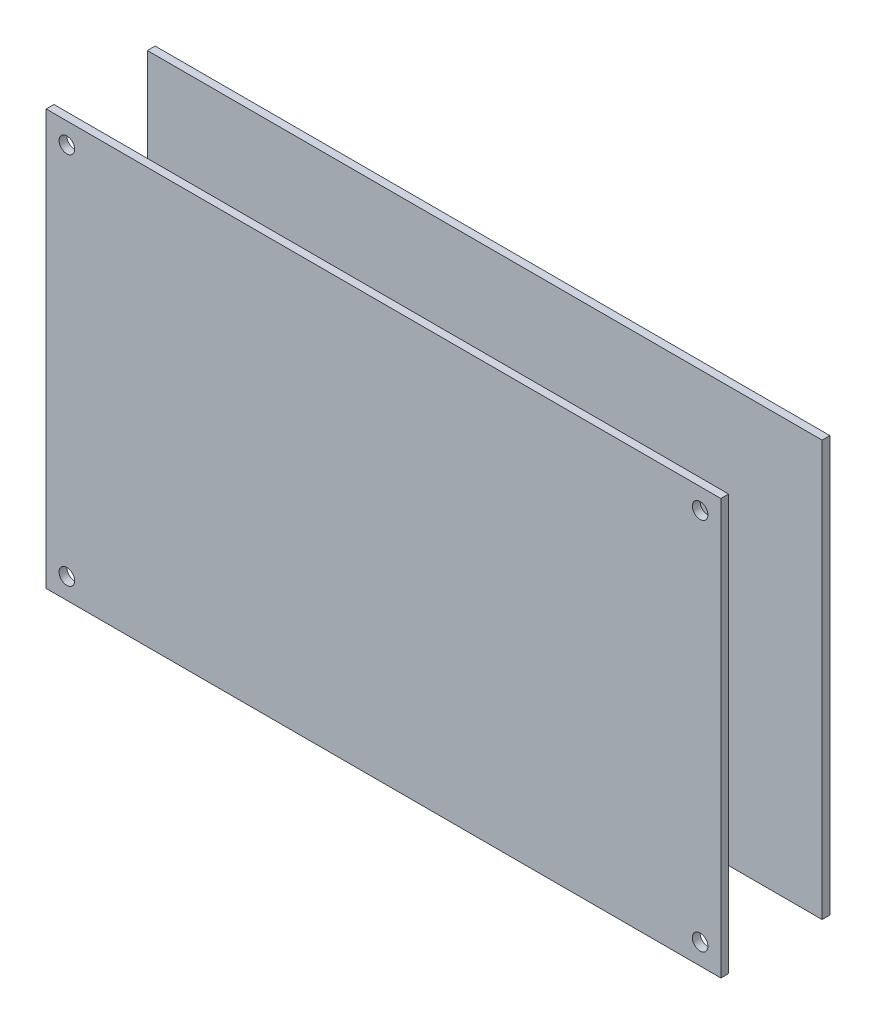
ISO-10303-21;
HEADER;
FILE_DESCRIPTION(('STEP AP214'),'2;1');
FILE_NAME('part.step','',(''),(''),'','','');
FILE_SCHEMA(('AUTOMOTIVE_DESIGN { 1 0 10303 214 1 1 1 1 }'));
ENDSEC;
DATA;
#1=APPLICATION_CONTEXT('core data for automotive mechanical design processes');
#2=APPLICATION_PROTOCOL_DEFINITION('international standard','automotive_design',2000,#1);
#3=PRODUCT_CONTEXT('',#1,'mechanical');
#4=PRODUCT('Part','Part','',(#3));
#5=PRODUCT_RELATED_PRODUCT_CATEGORY('part','',(#4));
#6=PRODUCT_DEFINITION_FORMATION('','',#4);
#7=PRODUCT_DEFINITION_CONTEXT('part definition',#1,'design');
#8=PRODUCT_DEFINITION('design','',#6,#7);
#9=PRODUCT_DEFINITION_SHAPE('','',#8);
#10=(LENGTH_UNIT() NAMED_UNIT(*) SI_UNIT(.MILLI.,.METRE.));
#11=(NAMED_UNIT(*) PLANE_ANGLE_UNIT() SI_UNIT($,.RADIAN.));
#12=(NAMED_UNIT(*) SI_UNIT($,.STERADIAN.) SOLID_ANGLE_UNIT());
#13=UNCERTAINTY_MEASURE_WITH_UNIT(LENGTH_MEASURE(1.E-05),#10,'distance_accuracy_value','');
#14=(GEOMETRIC_REPRESENTATION_CONTEXT(3) GLOBAL_UNCERTAINTY_ASSIGNED_CONTEXT((#13)) GLOBAL_UNIT_ASSIGNED_CONTEXT((#10,
#11,#12)) REPRESENTATION_CONTEXT('',''));
#15=CARTESIAN_POINT('',(0.,0.,0.));
#16=DIRECTION('',(0.,0.,1.));
#17=DIRECTION('',(1.,0.,0.));
#18=AXIS2_PLACEMENT_3D('',#15,#16,#17);
#19=CARTESIAN_POINT('',(0.,0.,21.));
#20=DIRECTION('',(1.,0.,0.));
#21=DIRECTION('',(0.,0.,-1.));
#22=AXIS2_PLACEMENT_3D('',#19,#20,#21);
#23=PLANE('',#22);
#24=DIRECTION('',(0.,-1.,0.));
#25=VECTOR('',#24,1.);
#26=CARTESIAN_POINT('',(0.,0.,1.5));
#27=LINE('',#26,#25);
#28=CARTESIAN_POINT('',(0.,80.,1.5));
#29=VERTEX_POINT('',#28);
#30=CARTESIAN_POINT('',(0.,0.,1.5));
#31=VERTEX_POINT('',#30);
#32=EDGE_CURVE('E71',#29,#31,#27,.T.);
#33=ORIENTED_EDGE('',*,*,#32,.F.);
#34=DIRECTION('',(0.,0.,-1.));
#35=VECTOR('',#34,1.);
#36=CARTESIAN_POINT('',(0.,80.,21.));
#37=LINE('',#36,#35);
#38=CARTESIAN_POINT('',(0.,80.,0.));
#39=VERTEX_POINT('',#38);
#40=EDGE_CURVE('E58',#29,#39,#37,.T.);
#41=ORIENTED_EDGE('',*,*,#40,.T.);
#42=DIRECTION('',(0.,-1.,0.));
#43=VECTOR('',#42,1.);
#44=CARTESIAN_POINT('',(0.,0.,0.));
#45=LINE('',#44,#43);
#46=CARTESIAN_POINT('',(0.,0.,0.));
#47=VERTEX_POINT('',#46);
#48=EDGE_CURVE('E168',#39,#47,#45,.T.);
#49=ORIENTED_EDGE('',*,*,#48,.T.);
#50=DIRECTION('',(0.,0.,-1.));
#51=VECTOR('',#50,1.);
#52=CARTESIAN_POINT('',(0.,0.,21.));
#53=LINE('',#52,#51);
#54=EDGE_CURVE('E166',#31,#47,#53,.T.);
#55=ORIENTED_EDGE('',*,*,#54,.F.);
#56=EDGE_LOOP('',(#33,#41,#49,#55));
#57=FACE_BOUND('',#56,.T.);
#58=ADVANCED_FACE('F55',(#57),#23,.F.);
#59=CARTESIAN_POINT('',(0.,0.,21.));
#60=DIRECTION('',(0.,1.,0.));
#61=DIRECTION('',(0.,0.,1.));
#62=AXIS2_PLACEMENT_3D('',#59,#60,#61);
#63=PLANE('',#62);
#64=DIRECTION('',(1.,0.,0.));
#65=VECTOR('',#64,1.);
#66=CARTESIAN_POINT('',(0.,0.,1.5));
#67=LINE('',#66,#65);
#68=CARTESIAN_POINT('',(130.,0.,1.5));
#69=VERTEX_POINT('',#68);
#70=EDGE_CURVE('E132',#31,#69,#67,.T.);
#71=ORIENTED_EDGE('',*,*,#70,.F.);
#72=ORIENTED_EDGE('',*,*,#54,.T.);
#73=DIRECTION('',(1.,0.,0.));
#74=VECTOR('',#73,1.);
#75=CARTESIAN_POINT('',(0.,0.,0.));
#76=LINE('',#75,#74);
#77=CARTESIAN_POINT('',(130.,0.,0.));
#78=VERTEX_POINT('',#77);
#79=EDGE_CURVE('E165',#47,#78,#76,.T.);
#80=ORIENTED_EDGE('',*,*,#79,.T.);
#81=DIRECTION('',(0.,0.,-1.));
#82=VECTOR('',#81,1.);
#83=CARTESIAN_POINT('',(130.,0.,21.));
#84=LINE('',#83,#82);
#85=EDGE_CURVE('E164',#69,#78,#84,.T.);
#86=ORIENTED_EDGE('',*,*,#85,.F.);
#87=EDGE_LOOP('',(#71,#72,#80,#86));
#88=FACE_BOUND('',#87,.T.);
#89=ADVANCED_FACE('F203',(#88),#63,.F.);
#90=CARTESIAN_POINT('',(130.,0.,21.));
#91=DIRECTION('',(-1.,0.,0.));
#92=DIRECTION('',(0.,0.,1.));
#93=AXIS2_PLACEMENT_3D('',#90,#91,#92);
#94=PLANE('',#93);
#95=DIRECTION('',(0.,0.,-1.));
#96=VECTOR('',#95,1.);
#97=CARTESIAN_POINT('',(130.,80.,21.));
#98=LINE('',#97,#96);
#99=CARTESIAN_POINT('',(130.,80.,1.5));
#100=VERTEX_POINT('',#99);
#101=CARTESIAN_POINT('',(130.,80.,0.));
#102=VERTEX_POINT('',#101);
#103=EDGE_CURVE('E161',#100,#102,#98,.T.);
#104=ORIENTED_EDGE('',*,*,#103,.F.);
#105=DIRECTION('',(0.,-1.,0.));
#106=VECTOR('',#105,1.);
#107=CARTESIAN_POINT('',(130.,88.5,1.5));
#108=LINE('',#107,#106);
#109=EDGE_CURVE('E78',#100,#69,#108,.T.);
#110=ORIENTED_EDGE('',*,*,#109,.T.);
#111=ORIENTED_EDGE('',*,*,#85,.T.);
#112=DIRECTION('',(0.,1.,0.));
#113=VECTOR('',#112,1.);
#114=CARTESIAN_POINT('',(130.,0.,0.));
#115=LINE('',#114,#113);
#116=EDGE_CURVE('E162',#78,#102,#115,.T.);
#117=ORIENTED_EDGE('',*,*,#116,.T.);
#118=EDGE_LOOP('',(#104,#110,#111,#117));
#119=FACE_BOUND('',#118,.T.);
#120=ADVANCED_FACE('F207',(#119),#94,.F.);
#121=CARTESIAN_POINT('',(0.,80.,21.));
#122=DIRECTION('',(0.,-1.,0.));
#123=DIRECTION('',(0.,0.,-1.));
#124=AXIS2_PLACEMENT_3D('',#121,#122,#123);
#125=PLANE('',#124);
#126=ORIENTED_EDGE('',*,*,#40,.F.);
#127=DIRECTION('',(1.,0.,0.));
#128=VECTOR('',#127,1.);
#129=CARTESIAN_POINT('',(0.,80.,1.5));
#130=LINE('',#129,#128);
#131=EDGE_CURVE('E159',#29,#100,#130,.T.);
#132=ORIENTED_EDGE('',*,*,#131,.T.);
#133=ORIENTED_EDGE('',*,*,#103,.T.);
#134=DIRECTION('',(-1.,0.,0.));
#135=VECTOR('',#134,1.);
#136=CARTESIAN_POINT('',(0.,80.,0.));
#137=LINE('',#136,#135);
#138=EDGE_CURVE('E149',#102,#39,#137,.T.);
#139=ORIENTED_EDGE('',*,*,#138,.T.);
#140=EDGE_LOOP('',(#126,#132,#133,#139));
#141=FACE_BOUND('',#140,.T.);
#142=ADVANCED_FACE('F212',(#141),#125,.F.);
#143=CARTESIAN_POINT('',(0.,0.,0.));
#144=DIRECTION('',(0.,0.,-1.));
#145=DIRECTION('',(-1.,0.,0.));
#146=AXIS2_PLACEMENT_3D('',#143,#144,#145);
#147=PLANE('',#146);
#148=DIRECTION('',(-1.,0.,0.));
#149=VECTOR('',#148,1.);
#150=CARTESIAN_POINT('',(116.910280936321,5.93796427226272,0.));
#151=LINE('',#150,#149);
#152=CARTESIAN_POINT('',(116.910280936321,5.93796427226272,0.));
#153=VERTEX_POINT('',#152);
#154=CARTESIAN_POINT('',(11.4102809363213,5.93796427226272,0.));
#155=VERTEX_POINT('',#154);
#156=EDGE_CURVE('E121',#153,#155,#151,.T.);
#157=ORIENTED_EDGE('',*,*,#156,.F.);
#158=DIRECTION('',(0.,-1.,0.));
#159=VECTOR('',#158,1.);
#160=CARTESIAN_POINT('',(116.910280936321,73.7379642722627,0.));
#161=LINE('',#160,#159);
#162=CARTESIAN_POINT('',(116.910280936321,73.7379642722627,0.));
#163=VERTEX_POINT('',#162);
#164=EDGE_CURVE('E185',#163,#153,#161,.T.);
#165=ORIENTED_EDGE('',*,*,#164,.F.);
#166=DIRECTION('',(-1.,0.,0.));
#167=VECTOR('',#166,1.);
#168=CARTESIAN_POINT('',(116.910280936321,73.7379642722627,0.));
#169=LINE('',#168,#167);
#170=CARTESIAN_POINT('',(11.4102809363213,73.7379642722627,0.));
#171=VERTEX_POINT('',#170);
#172=EDGE_CURVE('E146',#163,#171,#169,.T.);
#173=ORIENTED_EDGE('',*,*,#172,.T.);
#174=DIRECTION('',(0.,-1.,0.));
#175=VECTOR('',#174,1.);
#176=CARTESIAN_POINT('',(11.4102809363213,73.7379642722627,0.));
#177=LINE('',#176,#175);
#178=EDGE_CURVE('E137',#171,#155,#177,.T.);
#179=ORIENTED_EDGE('',*,*,#178,.T.);
#180=EDGE_LOOP('',(#157,#165,#173,#179));
#181=FACE_BOUND('',#180,.T.);
#182=ORIENTED_EDGE('',*,*,#48,.F.);
#183=ORIENTED_EDGE('',*,*,#138,.F.);
#184=ORIENTED_EDGE('',*,*,#116,.F.);
#185=ORIENTED_EDGE('',*,*,#79,.F.);
#186=EDGE_LOOP('',(#182,#183,#184,#185));
#187=FACE_BOUND('',#186,.T.);
#188=ADVANCED_FACE('F143',(#181,#187),#147,.T.);
#189=CARTESIAN_POINT('',(0.,0.,1.5));
#190=DIRECTION('',(0.,0.,-1.));
#191=DIRECTION('',(-1.,0.,0.));
#192=AXIS2_PLACEMENT_3D('',#189,#190,#191);
#193=PLANE('',#192);
#194=ORIENTED_EDGE('',*,*,#32,.T.);
#195=ORIENTED_EDGE('',*,*,#70,.T.);
#196=ORIENTED_EDGE('',*,*,#109,.F.);
#197=ORIENTED_EDGE('',*,*,#131,.F.);
#198=EDGE_LOOP('',(#194,#195,#196,#197));
#199=FACE_BOUND('',#198,.T.);
#200=ADVANCED_FACE('F220',(#199),#193,.F.);
#201=CARTESIAN_POINT('',(116.910280936321,5.93796427226272,-5.));
#202=DIRECTION('',(0.,1.,0.));
#203=DIRECTION('',(0.,0.,1.));
#204=AXIS2_PLACEMENT_3D('',#201,#202,#203);
#205=PLANE('',#204);
#206=ORIENTED_EDGE('',*,*,#156,.T.);
#207=DIRECTION('',(0.,0.,1.));
#208=VECTOR('',#207,1.);
#209=CARTESIAN_POINT('',(11.4102809363213,5.93796427226272,-5.));
#210=LINE('',#209,#208);
#211=CARTESIAN_POINT('',(11.4102809363213,5.93796427226272,-5.));
#212=VERTEX_POINT('',#211);
#213=EDGE_CURVE('E125',#212,#155,#210,.T.);
#214=ORIENTED_EDGE('',*,*,#213,.F.);
#215=DIRECTION('',(-1.,0.,0.));
#216=VECTOR('',#215,1.);
#217=CARTESIAN_POINT('',(116.910280936321,5.93796427226272,-5.));
#218=LINE('',#217,#216);
#219=CARTESIAN_POINT('',(116.910280936321,5.93796427226272,-5.));
#220=VERTEX_POINT('',#219);
#221=EDGE_CURVE('E63',#220,#212,#218,.T.);
#222=ORIENTED_EDGE('',*,*,#221,.F.);
#223=DIRECTION('',(0.,0.,1.));
#224=VECTOR('',#223,1.);
#225=CARTESIAN_POINT('',(116.910280936321,5.93796427226272,-5.));
#226=LINE('',#225,#224);
#227=EDGE_CURVE('E128',#220,#153,#226,.T.);
#228=ORIENTED_EDGE('',*,*,#227,.T.);
#229=EDGE_LOOP('',(#206,#214,#222,#228));
#230=FACE_BOUND('',#229,.T.);
#231=ADVANCED_FACE('F123',(#230),#205,.F.);
#232=CARTESIAN_POINT('',(11.4102809363213,73.7379642722627,-5.));
#233=DIRECTION('',(-1.,0.,0.));
#234=DIRECTION('',(0.,-1.,0.));
#235=AXIS2_PLACEMENT_3D('',#232,#233,#234);
#236=PLANE('',#235);
#237=ORIENTED_EDGE('',*,*,#178,.F.);
#238=DIRECTION('',(0.,0.,1.));
#239=VECTOR('',#238,1.);
#240=CARTESIAN_POINT('',(11.4102809363213,73.7379642722627,-5.));
#241=LINE('',#240,#239);
#242=CARTESIAN_POINT('',(11.4102809363213,73.7379642722627,-5.));
#243=VERTEX_POINT('',#242);
#244=EDGE_CURVE('E155',#243,#171,#241,.T.);
#245=ORIENTED_EDGE('',*,*,#244,.F.);
#246=DIRECTION('',(0.,-1.,0.));
#247=VECTOR('',#246,1.);
#248=CARTESIAN_POINT('',(11.4102809363213,73.7379642722627,-5.));
#249=LINE('',#248,#247);
#250=EDGE_CURVE('E140',#243,#212,#249,.T.);
#251=ORIENTED_EDGE('',*,*,#250,.T.);
#252=ORIENTED_EDGE('',*,*,#213,.T.);
#253=EDGE_LOOP('',(#237,#245,#251,#252));
#254=FACE_BOUND('',#253,.T.);
#255=ADVANCED_FACE('F136',(#254),#236,.T.);
#256=CARTESIAN_POINT('',(116.910280936321,73.7379642722627,-5.));
#257=DIRECTION('',(0.,1.,0.));
#258=DIRECTION('',(0.,0.,1.));
#259=AXIS2_PLACEMENT_3D('',#256,#257,#258);
#260=PLANE('',#259);
#261=ORIENTED_EDGE('',*,*,#172,.F.);
#262=DIRECTION('',(0.,0.,1.));
#263=VECTOR('',#262,1.);
#264=CARTESIAN_POINT('',(116.910280936321,73.7379642722627,-5.));
#265=LINE('',#264,#263);
#266=CARTESIAN_POINT('',(116.910280936321,73.7379642722627,-5.));
#267=VERTEX_POINT('',#266);
#268=EDGE_CURVE('E158',#267,#163,#265,.T.);
#269=ORIENTED_EDGE('',*,*,#268,.F.);
#270=DIRECTION('',(-1.,0.,0.));
#271=VECTOR('',#270,1.);
#272=CARTESIAN_POINT('',(116.910280936321,73.7379642722627,-5.));
#273=LINE('',#272,#271);
#274=EDGE_CURVE('E141',#267,#243,#273,.T.);
#275=ORIENTED_EDGE('',*,*,#274,.T.);
#276=ORIENTED_EDGE('',*,*,#244,.T.);
#277=EDGE_LOOP('',(#261,#269,#275,#276));
#278=FACE_BOUND('',#277,.T.);
#279=ADVANCED_FACE('F192',(#278),#260,.T.);
#280=CARTESIAN_POINT('',(116.910280936321,73.7379642722627,-5.));
#281=DIRECTION('',(-1.,0.,0.));
#282=DIRECTION('',(0.,0.,1.));
#283=AXIS2_PLACEMENT_3D('',#280,#281,#282);
#284=PLANE('',#283);
#285=ORIENTED_EDGE('',*,*,#164,.T.);
#286=ORIENTED_EDGE('',*,*,#227,.F.);
#287=DIRECTION('',(0.,-1.,0.));
#288=VECTOR('',#287,1.);
#289=CARTESIAN_POINT('',(116.910280936321,73.7379642722627,-5.));
#290=LINE('',#289,#288);
#291=EDGE_CURVE('E12',#267,#220,#290,.T.);
#292=ORIENTED_EDGE('',*,*,#291,.F.);
#293=ORIENTED_EDGE('',*,*,#268,.T.);
#294=EDGE_LOOP('',(#285,#286,#292,#293));
#295=FACE_BOUND('',#294,.T.);
#296=ADVANCED_FACE('F188',(#295),#284,.F.);
#297=CARTESIAN_POINT('',(0.,0.,-5.));
#298=DIRECTION('',(0.,0.,1.));
#299=DIRECTION('',(1.,0.,0.));
#300=AXIS2_PLACEMENT_3D('',#297,#298,#299);
#301=PLANE('',#300);
#302=ORIENTED_EDGE('',*,*,#221,.T.);
#303=ORIENTED_EDGE('',*,*,#250,.F.);
#304=ORIENTED_EDGE('',*,*,#274,.F.);
#305=ORIENTED_EDGE('',*,*,#291,.T.);
#306=EDGE_LOOP('',(#302,#303,#304,#305));
#307=FACE_BOUND('',#306,.T.);
#308=ADVANCED_FACE('F194',(#307),#301,.F.);
#309=CLOSED_SHELL('',(#58,#89,#120,#142,#188,#200,#231,#255,#279,#296,#308));
#310=MANIFOLD_SOLID_BREP('B2',#309);
#311=CARTESIAN_POINT('',(0.,0.,21.));
#312=DIRECTION('',(0.,0.,-1.));
#313=DIRECTION('',(-1.,0.,0.));
#314=AXIS2_PLACEMENT_3D('',#311,#312,#313);
#315=PLANE('',#314);
#316=CARTESIAN_POINT('',(4.00000000000001,4.00000000000001,21.));
#317=DIRECTION('',(0.,0.,1.));
#318=DIRECTION('',(1.,0.,0.));
#319=AXIS2_PLACEMENT_3D('',#316,#317,#318);
#320=CIRCLE('',#319,1.5);
#321=CARTESIAN_POINT('',(5.50000000000001,4.00000000000001,21.));
#322=VERTEX_POINT('',#321);
#323=EDGE_CURVE('E454',#322,#322,#320,.T.);
#324=ORIENTED_EDGE('',*,*,#323,.F.);
#325=EDGE_LOOP('',(#324));
#326=FACE_BOUND('',#325,.T.);
#327=CARTESIAN_POINT('',(126.,76.,21.));
#328=DIRECTION('',(0.,0.,1.));
#329=DIRECTION('',(1.,0.,0.));
#330=AXIS2_PLACEMENT_3D('',#327,#328,#329);
#331=CIRCLE('',#330,1.5);
#332=CARTESIAN_POINT('',(127.5,76.,21.));
#333=VERTEX_POINT('',#332);
#334=EDGE_CURVE('E457',#333,#333,#331,.T.);
#335=ORIENTED_EDGE('',*,*,#334,.F.);
#336=EDGE_LOOP('',(#335));
#337=FACE_BOUND('',#336,.T.);
#338=CARTESIAN_POINT('',(126.,4.00000000000001,21.));
#339=DIRECTION('',(0.,0.,1.));
#340=DIRECTION('',(1.,0.,0.));
#341=AXIS2_PLACEMENT_3D('',#338,#339,#340);
#342=CIRCLE('',#341,1.5);
#343=CARTESIAN_POINT('',(127.5,4.00000000000001,21.));
#344=VERTEX_POINT('',#343);
#345=EDGE_CURVE('E377',#344,#344,#342,.T.);
#346=ORIENTED_EDGE('',*,*,#345,.F.);
#347=EDGE_LOOP('',(#346));
#348=FACE_BOUND('',#347,.T.);
#349=CARTESIAN_POINT('',(4.,76.,21.));
#350=DIRECTION('',(0.,0.,1.));
#351=DIRECTION('',(1.,0.,0.));
#352=AXIS2_PLACEMENT_3D('',#349,#350,#351);
#353=CIRCLE('',#352,1.5);
#354=CARTESIAN_POINT('',(5.5,76.,21.));
#355=VERTEX_POINT('',#354);
#356=EDGE_CURVE('E390',#355,#355,#353,.T.);
#357=ORIENTED_EDGE('',*,*,#356,.F.);
#358=EDGE_LOOP('',(#357));
#359=FACE_BOUND('',#358,.T.);
#360=DIRECTION('',(0.,-1.,0.));
#361=VECTOR('',#360,1.);
#362=CARTESIAN_POINT('',(0.,0.,21.));
#363=LINE('',#362,#361);
#364=CARTESIAN_POINT('',(0.,80.,21.));
#365=VERTEX_POINT('',#364);
#366=CARTESIAN_POINT('',(0.,0.,21.));
#367=VERTEX_POINT('',#366);
#368=EDGE_CURVE('E367',#365,#367,#363,.T.);
#369=ORIENTED_EDGE('',*,*,#368,.T.);
#370=DIRECTION('',(1.,0.,0.));
#371=VECTOR('',#370,1.);
#372=CARTESIAN_POINT('',(0.,0.,21.));
#373=LINE('',#372,#371);
#374=CARTESIAN_POINT('',(130.,0.,21.));
#375=VERTEX_POINT('',#374);
#376=EDGE_CURVE('E405',#367,#375,#373,.T.);
#377=ORIENTED_EDGE('',*,*,#376,.T.);
#378=DIRECTION('',(0.,1.,0.));
#379=VECTOR('',#378,1.);
#380=CARTESIAN_POINT('',(130.,0.,21.));
#381=LINE('',#380,#379);
#382=CARTESIAN_POINT('',(130.,80.,21.));
#383=VERTEX_POINT('',#382);
#384=EDGE_CURVE('E339',#375,#383,#381,.T.);
#385=ORIENTED_EDGE('',*,*,#384,.T.);
#386=DIRECTION('',(-1.,0.,0.));
#387=VECTOR('',#386,1.);
#388=CARTESIAN_POINT('',(0.,80.,21.));
#389=LINE('',#388,#387);
#390=EDGE_CURVE('E334',#383,#365,#389,.T.);
#391=ORIENTED_EDGE('',*,*,#390,.T.);
#392=EDGE_LOOP('',(#369,#377,#385,#391));
#393=FACE_BOUND('',#392,.T.);
#394=ADVANCED_FACE('F317',(#326,#337,#348,#359,#393),#315,.F.);
#395=CARTESIAN_POINT('',(0.,0.,21.));
#396=DIRECTION('',(0.,1.,0.));
#397=DIRECTION('',(0.,0.,1.));
#398=AXIS2_PLACEMENT_3D('',#395,#396,#397);
#399=PLANE('',#398);
#400=DIRECTION('',(0.,0.,-1.));
#401=VECTOR('',#400,1.);
#402=CARTESIAN_POINT('',(0.,0.,21.));
#403=LINE('',#402,#401);
#404=CARTESIAN_POINT('',(0.,0.,19.5));
#405=VERTEX_POINT('',#404);
#406=EDGE_CURVE('E53',#367,#405,#403,.T.);
#407=ORIENTED_EDGE('',*,*,#406,.T.);
#408=DIRECTION('',(1.,0.,0.));
#409=VECTOR('',#408,1.);
#410=CARTESIAN_POINT('',(0.,0.,19.5));
#411=LINE('',#410,#409);
#412=CARTESIAN_POINT('',(130.,0.,19.5));
#413=VERTEX_POINT('',#412);
#414=EDGE_CURVE('E368',#405,#413,#411,.T.);
#415=ORIENTED_EDGE('',*,*,#414,.T.);
#416=DIRECTION('',(0.,0.,-1.));
#417=VECTOR('',#416,1.);
#418=CARTESIAN_POINT('',(130.,0.,21.));
#419=LINE('',#418,#417);
#420=EDGE_CURVE('E326',#375,#413,#419,.T.);
#421=ORIENTED_EDGE('',*,*,#420,.F.);
#422=ORIENTED_EDGE('',*,*,#376,.F.);
#423=EDGE_LOOP('',(#407,#415,#421,#422));
#424=FACE_BOUND('',#423,.T.);
#425=ADVANCED_FACE('F409',(#424),#399,.F.);
#426=CARTESIAN_POINT('',(4.,76.,11.));
#427=DIRECTION('',(0.,0.,1.));
#428=DIRECTION('',(1.,0.,0.));
#429=AXIS2_PLACEMENT_3D('',#426,#427,#428);
#430=CYLINDRICAL_SURFACE('',#429,1.5);
#431=CARTESIAN_POINT('',(4.,76.,19.5));
#432=DIRECTION('',(0.,0.,-1.));
#433=DIRECTION('',(-1.,0.,0.));
#434=AXIS2_PLACEMENT_3D('',#431,#432,#433);
#435=CIRCLE('',#434,1.5);
#436=CARTESIAN_POINT('',(2.5,76.,19.5));
#437=VERTEX_POINT('',#436);
#438=EDGE_CURVE('E386',#437,#437,#435,.T.);
#439=ORIENTED_EDGE('',*,*,#438,.T.);
#440=EDGE_LOOP('',(#439));
#441=FACE_BOUND('',#440,.T.);
#442=ORIENTED_EDGE('',*,*,#356,.T.);
#443=EDGE_LOOP('',(#442));
#444=FACE_BOUND('',#443,.T.);
#445=ADVANCED_FACE('F422',(#441,#444),#430,.F.);
#446=CARTESIAN_POINT('',(126.,4.00000000000001,11.));
#447=DIRECTION('',(0.,0.,1.));
#448=DIRECTION('',(1.,0.,0.));
#449=AXIS2_PLACEMENT_3D('',#446,#447,#448);
#450=CYLINDRICAL_SURFACE('',#449,1.5);
#451=CARTESIAN_POINT('',(126.,4.00000000000001,19.5));
#452=DIRECTION('',(0.,0.,-1.));
#453=DIRECTION('',(-1.,0.,0.));
#454=AXIS2_PLACEMENT_3D('',#451,#452,#453);
#455=CIRCLE('',#454,1.5);
#456=CARTESIAN_POINT('',(124.5,4.00000000000001,19.5));
#457=VERTEX_POINT('',#456);
#458=EDGE_CURVE('E389',#457,#457,#455,.T.);
#459=ORIENTED_EDGE('',*,*,#458,.T.);
#460=EDGE_LOOP('',(#459));
#461=FACE_BOUND('',#460,.T.);
#462=ORIENTED_EDGE('',*,*,#345,.T.);
#463=EDGE_LOOP('',(#462));
#464=FACE_BOUND('',#463,.T.);
#465=ADVANCED_FACE('F440',(#461,#464),#450,.F.);
#466=CARTESIAN_POINT('',(126.,76.,11.));
#467=DIRECTION('',(0.,0.,1.));
#468=DIRECTION('',(1.,0.,0.));
#469=AXIS2_PLACEMENT_3D('',#466,#467,#468);
#470=CYLINDRICAL_SURFACE('',#469,1.5);
#471=CARTESIAN_POINT('',(126.,76.,19.5));
#472=DIRECTION('',(0.,0.,-1.));
#473=DIRECTION('',(-1.,0.,0.));
#474=AXIS2_PLACEMENT_3D('',#471,#472,#473);
#475=CIRCLE('',#474,1.5);
#476=CARTESIAN_POINT('',(124.5,76.,19.5));
#477=VERTEX_POINT('',#476);
#478=EDGE_CURVE('E392',#477,#477,#475,.T.);
#479=ORIENTED_EDGE('',*,*,#478,.T.);
#480=EDGE_LOOP('',(#479));
#481=FACE_BOUND('',#480,.T.);
#482=ORIENTED_EDGE('',*,*,#334,.T.);
#483=EDGE_LOOP('',(#482));
#484=FACE_BOUND('',#483,.T.);
#485=ADVANCED_FACE('F435',(#481,#484),#470,.F.);
#486=CARTESIAN_POINT('',(4.00000000000001,4.00000000000001,11.));
#487=DIRECTION('',(0.,0.,1.));
#488=DIRECTION('',(1.,0.,0.));
#489=AXIS2_PLACEMENT_3D('',#486,#487,#488);
#490=CYLINDRICAL_SURFACE('',#489,1.5);
#491=CARTESIAN_POINT('',(4.00000000000001,4.00000000000001,19.5));
#492=DIRECTION('',(0.,0.,-1.));
#493=DIRECTION('',(-1.,0.,0.));
#494=AXIS2_PLACEMENT_3D('',#491,#492,#493);
#495=CIRCLE('',#494,1.5);
#496=CARTESIAN_POINT('',(2.5,4.00000000000001,19.5));
#497=VERTEX_POINT('',#496);
#498=EDGE_CURVE('E321',#497,#497,#495,.T.);
#499=ORIENTED_EDGE('',*,*,#498,.T.);
#500=EDGE_LOOP('',(#499));
#501=FACE_BOUND('',#500,.T.);
#502=ORIENTED_EDGE('',*,*,#323,.T.);
#503=EDGE_LOOP('',(#502));
#504=FACE_BOUND('',#503,.T.);
#505=ADVANCED_FACE('F429',(#501,#504),#490,.F.);
#506=CARTESIAN_POINT('',(0.,80.,21.));
#507=DIRECTION('',(0.,-1.,0.));
#508=DIRECTION('',(0.,0.,-1.));
#509=AXIS2_PLACEMENT_3D('',#506,#507,#508);
#510=PLANE('',#509);
#511=DIRECTION('',(0.,0.,-1.));
#512=VECTOR('',#511,1.);
#513=CARTESIAN_POINT('',(130.,80.,21.));
#514=LINE('',#513,#512);
#515=CARTESIAN_POINT('',(130.,80.,19.5));
#516=VERTEX_POINT('',#515);
#517=EDGE_CURVE('E363',#383,#516,#514,.T.);
#518=ORIENTED_EDGE('',*,*,#517,.T.);
#519=DIRECTION('',(-1.,0.,0.));
#520=VECTOR('',#519,1.);
#521=CARTESIAN_POINT('',(0.,80.,19.5));
#522=LINE('',#521,#520);
#523=CARTESIAN_POINT('',(0.,80.,19.5));
#524=VERTEX_POINT('',#523);
#525=EDGE_CURVE('E371',#516,#524,#522,.T.);
#526=ORIENTED_EDGE('',*,*,#525,.T.);
#527=DIRECTION('',(0.,0.,-1.));
#528=VECTOR('',#527,1.);
#529=CARTESIAN_POINT('',(0.,80.,21.));
#530=LINE('',#529,#528);
#531=EDGE_CURVE('E380',#365,#524,#530,.T.);
#532=ORIENTED_EDGE('',*,*,#531,.F.);
#533=ORIENTED_EDGE('',*,*,#390,.F.);
#534=EDGE_LOOP('',(#518,#526,#532,#533));
#535=FACE_BOUND('',#534,.T.);
#536=ADVANCED_FACE('F379',(#535),#510,.F.);
#537=CARTESIAN_POINT('',(0.,0.,19.5));
#538=DIRECTION('',(0.,0.,-1.));
#539=DIRECTION('',(-1.,0.,0.));
#540=AXIS2_PLACEMENT_3D('',#537,#538,#539);
#541=PLANE('',#540);
#542=ORIENTED_EDGE('',*,*,#498,.F.);
#543=EDGE_LOOP('',(#542));
#544=FACE_BOUND('',#543,.T.);
#545=ORIENTED_EDGE('',*,*,#478,.F.);
#546=EDGE_LOOP('',(#545));
#547=FACE_BOUND('',#546,.T.);
#548=ORIENTED_EDGE('',*,*,#458,.F.);
#549=EDGE_LOOP('',(#548));
#550=FACE_BOUND('',#549,.T.);
#551=ORIENTED_EDGE('',*,*,#438,.F.);
#552=EDGE_LOOP('',(#551));
#553=FACE_BOUND('',#552,.T.);
#554=DIRECTION('',(0.,-1.,0.));
#555=VECTOR('',#554,1.);
#556=CARTESIAN_POINT('',(0.,0.,19.5));
#557=LINE('',#556,#555);
#558=EDGE_CURVE('E374',#524,#405,#557,.T.);
#559=ORIENTED_EDGE('',*,*,#558,.F.);
#560=ORIENTED_EDGE('',*,*,#525,.F.);
#561=DIRECTION('',(0.,1.,0.));
#562=VECTOR('',#561,1.);
#563=CARTESIAN_POINT('',(130.,0.,19.5));
#564=LINE('',#563,#562);
#565=EDGE_CURVE('E359',#413,#516,#564,.T.);
#566=ORIENTED_EDGE('',*,*,#565,.F.);
#567=ORIENTED_EDGE('',*,*,#414,.F.);
#568=EDGE_LOOP('',(#559,#560,#566,#567));
#569=FACE_BOUND('',#568,.T.);
#570=ADVANCED_FACE('F372',(#544,#547,#550,#553,#569),#541,.T.);
#571=CARTESIAN_POINT('',(130.,0.,21.));
#572=DIRECTION('',(-1.,0.,0.));
#573=DIRECTION('',(0.,0.,1.));
#574=AXIS2_PLACEMENT_3D('',#571,#572,#573);
#575=PLANE('',#574);
#576=ORIENTED_EDGE('',*,*,#565,.T.);
#577=ORIENTED_EDGE('',*,*,#517,.F.);
#578=ORIENTED_EDGE('',*,*,#384,.F.);
#579=ORIENTED_EDGE('',*,*,#420,.T.);
#580=EDGE_LOOP('',(#576,#577,#578,#579));
#581=FACE_BOUND('',#580,.T.);
#582=ADVANCED_FACE('F361',(#581),#575,.F.);
#583=CARTESIAN_POINT('',(0.,0.,21.));
#584=DIRECTION('',(1.,0.,0.));
#585=DIRECTION('',(0.,0.,-1.));
#586=AXIS2_PLACEMENT_3D('',#583,#584,#585);
#587=PLANE('',#586);
#588=ORIENTED_EDGE('',*,*,#531,.T.);
#589=ORIENTED_EDGE('',*,*,#558,.T.);
#590=ORIENTED_EDGE('',*,*,#406,.F.);
#591=ORIENTED_EDGE('',*,*,#368,.F.);
#592=EDGE_LOOP('',(#588,#589,#590,#591));
#593=FACE_BOUND('',#592,.T.);
#594=ADVANCED_FACE('F319',(#593),#587,.F.);
#595=CLOSED_SHELL('',(#394,#425,#445,#465,#485,#505,#536,#570,#582,#594));
#596=MANIFOLD_SOLID_BREP('B6',#595);
#597=ADVANCED_BREP_SHAPE_REPRESENTATION('',(#18,#310,#596),#14);
#598=SHAPE_DEFINITION_REPRESENTATION(#9,#597);
ENDSEC;
END-ISO-10303-21;
